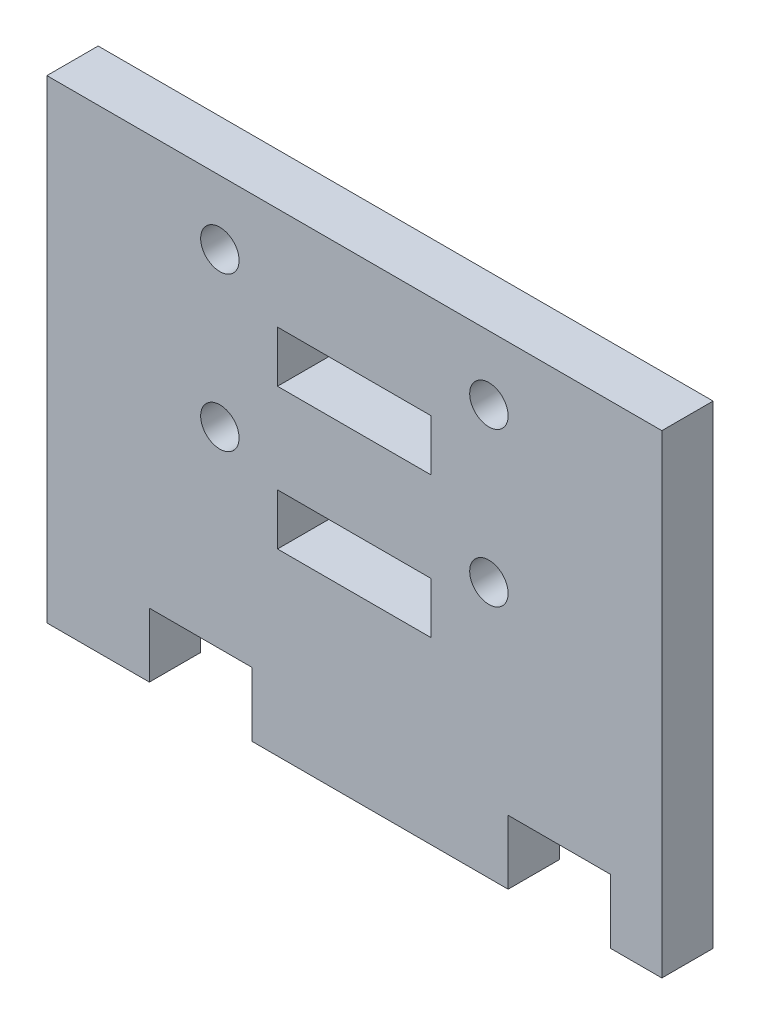
ISO-10303-21;
HEADER;
FILE_DESCRIPTION(('STEP AP214'),'2;1');
FILE_NAME('part.step','',(''),(''),'','','');
FILE_SCHEMA(('AUTOMOTIVE_DESIGN { 1 0 10303 214 1 1 1 1 }'));
ENDSEC;
DATA;
#1=APPLICATION_CONTEXT('core data for automotive mechanical design processes');
#2=APPLICATION_PROTOCOL_DEFINITION('international standard','automotive_design',2000,#1);
#3=PRODUCT_CONTEXT('',#1,'mechanical');
#4=PRODUCT('Part','Part','',(#3));
#5=PRODUCT_RELATED_PRODUCT_CATEGORY('part','',(#4));
#6=PRODUCT_DEFINITION_FORMATION('','',#4);
#7=PRODUCT_DEFINITION_CONTEXT('part definition',#1,'design');
#8=PRODUCT_DEFINITION('design','',#6,#7);
#9=PRODUCT_DEFINITION_SHAPE('','',#8);
#10=(LENGTH_UNIT() NAMED_UNIT(*) SI_UNIT(.MILLI.,.METRE.));
#11=(NAMED_UNIT(*) PLANE_ANGLE_UNIT() SI_UNIT($,.RADIAN.));
#12=(NAMED_UNIT(*) SI_UNIT($,.STERADIAN.) SOLID_ANGLE_UNIT());
#13=UNCERTAINTY_MEASURE_WITH_UNIT(LENGTH_MEASURE(1.E-05),#10,'distance_accuracy_value','');
#14=(GEOMETRIC_REPRESENTATION_CONTEXT(3) GLOBAL_UNCERTAINTY_ASSIGNED_CONTEXT((#13)) GLOBAL_UNIT_ASSIGNED_CONTEXT((#10,
#11,#12)) REPRESENTATION_CONTEXT('',''));
#15=CARTESIAN_POINT('',(0.,0.,0.));
#16=DIRECTION('',(0.,0.,1.));
#17=DIRECTION('',(1.,0.,0.));
#18=AXIS2_PLACEMENT_3D('',#15,#16,#17);
#19=CARTESIAN_POINT('',(0.,0.,2.));
#20=DIRECTION('',(0.,0.,-1.));
#21=DIRECTION('',(-1.,0.,0.));
#22=AXIS2_PLACEMENT_3D('',#19,#20,#21);
#23=PLANE('',#22);
#24=CARTESIAN_POINT('',(17.25,10.,2.));
#25=DIRECTION('',(0.,0.,1.));
#26=DIRECTION('',(-1.,0.,0.));
#27=AXIS2_PLACEMENT_3D('',#24,#25,#26);
#28=CIRCLE('',#27,0.750000000000002);
#29=CARTESIAN_POINT('',(16.5,10.,2.));
#30=VERTEX_POINT('',#29);
#31=EDGE_CURVE('E626',#30,#30,#28,.T.);
#32=ORIENTED_EDGE('',*,*,#31,.F.);
#33=EDGE_LOOP('',(#32));
#34=FACE_BOUND('',#33,.T.);
#35=DIRECTION('',(0.,-1.,0.));
#36=VECTOR('',#35,1.);
#37=CARTESIAN_POINT('',(9.00000000000001,9.,2.));
#38=LINE('',#37,#36);
#39=CARTESIAN_POINT('',(9.00000000000001,9.,2.));
#40=VERTEX_POINT('',#39);
#41=CARTESIAN_POINT('',(9.00000000000001,7.,2.));
#42=VERTEX_POINT('',#41);
#43=EDGE_CURVE('E169',#40,#42,#38,.T.);
#44=ORIENTED_EDGE('',*,*,#43,.F.);
#45=DIRECTION('',(-1.,0.,0.));
#46=VECTOR('',#45,1.);
#47=CARTESIAN_POINT('',(15.,9.,2.));
#48=LINE('',#47,#46);
#49=CARTESIAN_POINT('',(15.,9.,2.));
#50=VERTEX_POINT('',#49);
#51=EDGE_CURVE('E192',#50,#40,#48,.T.);
#52=ORIENTED_EDGE('',*,*,#51,.F.);
#53=DIRECTION('',(0.,1.,0.));
#54=VECTOR('',#53,1.);
#55=CARTESIAN_POINT('',(15.,7.,2.));
#56=LINE('',#55,#54);
#57=CARTESIAN_POINT('',(15.,7.,2.));
#58=VERTEX_POINT('',#57);
#59=EDGE_CURVE('E190',#58,#50,#56,.T.);
#60=ORIENTED_EDGE('',*,*,#59,.F.);
#61=DIRECTION('',(1.,0.,0.));
#62=VECTOR('',#61,1.);
#63=CARTESIAN_POINT('',(9.00000000000001,7.,2.));
#64=LINE('',#63,#62);
#65=EDGE_CURVE('E177',#42,#58,#64,.T.);
#66=ORIENTED_EDGE('',*,*,#65,.F.);
#67=EDGE_LOOP('',(#44,#52,#60,#66));
#68=FACE_BOUND('',#67,.T.);
#69=DIRECTION('',(1.,0.,0.));
#70=VECTOR('',#69,1.);
#71=CARTESIAN_POINT('',(9.00000000000001,12.5,2.));
#72=LINE('',#71,#70);
#73=CARTESIAN_POINT('',(9.00000000000001,12.5,2.));
#74=VERTEX_POINT('',#73);
#75=CARTESIAN_POINT('',(15.,12.5,2.));
#76=VERTEX_POINT('',#75);
#77=EDGE_CURVE('E214',#74,#76,#72,.T.);
#78=ORIENTED_EDGE('',*,*,#77,.F.);
#79=DIRECTION('',(0.,-1.,0.));
#80=VECTOR('',#79,1.);
#81=CARTESIAN_POINT('',(9.00000000000001,14.5,2.));
#82=LINE('',#81,#80);
#83=CARTESIAN_POINT('',(9.00000000000001,14.5,2.));
#84=VERTEX_POINT('',#83);
#85=EDGE_CURVE('E222',#84,#74,#82,.T.);
#86=ORIENTED_EDGE('',*,*,#85,.F.);
#87=DIRECTION('',(-1.,0.,0.));
#88=VECTOR('',#87,1.);
#89=CARTESIAN_POINT('',(15.,14.5,2.));
#90=LINE('',#89,#88);
#91=CARTESIAN_POINT('',(15.,14.5,2.));
#92=VERTEX_POINT('',#91);
#93=EDGE_CURVE('E219',#92,#84,#90,.T.);
#94=ORIENTED_EDGE('',*,*,#93,.F.);
#95=DIRECTION('',(0.,1.,0.));
#96=VECTOR('',#95,1.);
#97=CARTESIAN_POINT('',(15.,12.5,2.));
#98=LINE('',#97,#96);
#99=EDGE_CURVE('E216',#76,#92,#98,.T.);
#100=ORIENTED_EDGE('',*,*,#99,.F.);
#101=EDGE_LOOP('',(#78,#86,#94,#100));
#102=FACE_BOUND('',#101,.T.);
#103=DIRECTION('',(0.,-1.,0.));
#104=VECTOR('',#103,1.);
#105=CARTESIAN_POINT('',(0.,0.,2.));
#106=LINE('',#105,#104);
#107=CARTESIAN_POINT('',(0.,18.5,2.));
#108=VERTEX_POINT('',#107);
#109=CARTESIAN_POINT('',(0.,0.,2.));
#110=VERTEX_POINT('',#109);
#111=EDGE_CURVE('E245',#108,#110,#106,.T.);
#112=ORIENTED_EDGE('',*,*,#111,.T.);
#113=DIRECTION('',(1.,0.,0.));
#114=VECTOR('',#113,1.);
#115=CARTESIAN_POINT('',(4.,0.,2.));
#116=LINE('',#115,#114);
#117=CARTESIAN_POINT('',(4.,0.,2.));
#118=VERTEX_POINT('',#117);
#119=EDGE_CURVE('E248',#110,#118,#116,.T.);
#120=ORIENTED_EDGE('',*,*,#119,.T.);
#121=DIRECTION('',(0.,1.,0.));
#122=VECTOR('',#121,1.);
#123=CARTESIAN_POINT('',(4.,2.5,2.));
#124=LINE('',#123,#122);
#125=CARTESIAN_POINT('',(4.,2.5,2.));
#126=VERTEX_POINT('',#125);
#127=EDGE_CURVE('E251',#118,#126,#124,.T.);
#128=ORIENTED_EDGE('',*,*,#127,.T.);
#129=DIRECTION('',(1.,0.,0.));
#130=VECTOR('',#129,1.);
#131=CARTESIAN_POINT('',(4.,2.5,2.));
#132=LINE('',#131,#130);
#133=CARTESIAN_POINT('',(8.,2.5,2.));
#134=VERTEX_POINT('',#133);
#135=EDGE_CURVE('E253',#126,#134,#132,.T.);
#136=ORIENTED_EDGE('',*,*,#135,.T.);
#137=DIRECTION('',(0.,-1.,0.));
#138=VECTOR('',#137,1.);
#139=CARTESIAN_POINT('',(8.,0.,2.));
#140=LINE('',#139,#138);
#141=CARTESIAN_POINT('',(8.,0.,2.));
#142=VERTEX_POINT('',#141);
#143=EDGE_CURVE('E255',#134,#142,#140,.T.);
#144=ORIENTED_EDGE('',*,*,#143,.T.);
#145=DIRECTION('',(1.,0.,0.));
#146=VECTOR('',#145,1.);
#147=CARTESIAN_POINT('',(8.,0.,2.));
#148=LINE('',#147,#146);
#149=CARTESIAN_POINT('',(18.,0.,2.));
#150=VERTEX_POINT('',#149);
#151=EDGE_CURVE('E257',#142,#150,#148,.T.);
#152=ORIENTED_EDGE('',*,*,#151,.T.);
#153=DIRECTION('',(0.,1.,0.));
#154=VECTOR('',#153,1.);
#155=CARTESIAN_POINT('',(18.,0.,2.));
#156=LINE('',#155,#154);
#157=CARTESIAN_POINT('',(18.,2.5,2.));
#158=VERTEX_POINT('',#157);
#159=EDGE_CURVE('E259',#150,#158,#156,.T.);
#160=ORIENTED_EDGE('',*,*,#159,.T.);
#161=DIRECTION('',(1.,0.,0.));
#162=VECTOR('',#161,1.);
#163=CARTESIAN_POINT('',(18.,2.5,2.));
#164=LINE('',#163,#162);
#165=CARTESIAN_POINT('',(22.,2.5,2.));
#166=VERTEX_POINT('',#165);
#167=EDGE_CURVE('E261',#158,#166,#164,.T.);
#168=ORIENTED_EDGE('',*,*,#167,.T.);
#169=DIRECTION('',(0.,-1.,0.));
#170=VECTOR('',#169,1.);
#171=CARTESIAN_POINT('',(22.,2.5,2.));
#172=LINE('',#171,#170);
#173=CARTESIAN_POINT('',(22.,0.,2.));
#174=VERTEX_POINT('',#173);
#175=EDGE_CURVE('E263',#166,#174,#172,.T.);
#176=ORIENTED_EDGE('',*,*,#175,.T.);
#177=DIRECTION('',(1.,0.,0.));
#178=VECTOR('',#177,1.);
#179=CARTESIAN_POINT('',(22.,0.,2.));
#180=LINE('',#179,#178);
#181=CARTESIAN_POINT('',(24.,0.,2.));
#182=VERTEX_POINT('',#181);
#183=EDGE_CURVE('E265',#174,#182,#180,.T.);
#184=ORIENTED_EDGE('',*,*,#183,.T.);
#185=DIRECTION('',(0.,1.,0.));
#186=VECTOR('',#185,1.);
#187=CARTESIAN_POINT('',(24.,0.,2.));
#188=LINE('',#187,#186);
#189=CARTESIAN_POINT('',(24.,18.5,2.));
#190=VERTEX_POINT('',#189);
#191=EDGE_CURVE('E267',#182,#190,#188,.T.);
#192=ORIENTED_EDGE('',*,*,#191,.T.);
#193=DIRECTION('',(-1.,0.,0.));
#194=VECTOR('',#193,1.);
#195=CARTESIAN_POINT('',(0.,18.5,2.));
#196=LINE('',#195,#194);
#197=EDGE_CURVE('E269',#190,#108,#196,.T.);
#198=ORIENTED_EDGE('',*,*,#197,.T.);
#199=EDGE_LOOP('',(#112,#120,#128,#136,#144,#152,#160,#168,#176,#184,#192,#198));
#200=FACE_BOUND('',#199,.T.);
#201=CARTESIAN_POINT('',(6.75,16.,2.));
#202=DIRECTION('',(0.,0.,1.));
#203=DIRECTION('',(1.,0.,0.));
#204=AXIS2_PLACEMENT_3D('',#201,#202,#203);
#205=CIRCLE('',#204,0.750000000000002);
#206=CARTESIAN_POINT('',(7.50000000000001,16.,2.));
#207=VERTEX_POINT('',#206);
#208=EDGE_CURVE('E208',#207,#207,#205,.T.);
#209=ORIENTED_EDGE('',*,*,#208,.F.);
#210=EDGE_LOOP('',(#209));
#211=FACE_BOUND('',#210,.T.);
#212=CARTESIAN_POINT('',(6.75,9.99999999999999,2.));
#213=DIRECTION('',(0.,0.,1.));
#214=DIRECTION('',(1.,0.,0.));
#215=AXIS2_PLACEMENT_3D('',#212,#213,#214);
#216=CIRCLE('',#215,0.750000000000002);
#217=CARTESIAN_POINT('',(7.50000000000001,9.99999999999999,2.));
#218=VERTEX_POINT('',#217);
#219=EDGE_CURVE('E198',#218,#218,#216,.T.);
#220=ORIENTED_EDGE('',*,*,#219,.F.);
#221=EDGE_LOOP('',(#220));
#222=FACE_BOUND('',#221,.T.);
#223=CARTESIAN_POINT('',(17.25,16.,2.));
#224=DIRECTION('',(0.,0.,1.));
#225=DIRECTION('',(-1.,0.,0.));
#226=AXIS2_PLACEMENT_3D('',#223,#224,#225);
#227=CIRCLE('',#226,0.750000000000002);
#228=CARTESIAN_POINT('',(16.5,16.,2.));
#229=VERTEX_POINT('',#228);
#230=EDGE_CURVE('E617',#229,#229,#227,.T.);
#231=ORIENTED_EDGE('',*,*,#230,.F.);
#232=EDGE_LOOP('',(#231));
#233=FACE_BOUND('',#232,.T.);
#234=ADVANCED_FACE('F32',(#34,#68,#102,#200,#211,#222,#233),#23,.F.);
#235=CARTESIAN_POINT('',(0.,0.,0.));
#236=DIRECTION('',(0.,0.,-1.));
#237=DIRECTION('',(-1.,0.,0.));
#238=AXIS2_PLACEMENT_3D('',#235,#236,#237);
#239=PLANE('',#238);
#240=CARTESIAN_POINT('',(17.25,10.,0.));
#241=DIRECTION('',(0.,0.,1.));
#242=DIRECTION('',(-1.,0.,0.));
#243=AXIS2_PLACEMENT_3D('',#240,#241,#242);
#244=CIRCLE('',#243,0.750000000000002);
#245=CARTESIAN_POINT('',(16.5,10.,0.));
#246=VERTEX_POINT('',#245);
#247=EDGE_CURVE('E623',#246,#246,#244,.T.);
#248=ORIENTED_EDGE('',*,*,#247,.T.);
#249=EDGE_LOOP('',(#248));
#250=FACE_BOUND('',#249,.T.);
#251=DIRECTION('',(-1.,0.,0.));
#252=VECTOR('',#251,1.);
#253=CARTESIAN_POINT('',(15.,9.,0.));
#254=LINE('',#253,#252);
#255=CARTESIAN_POINT('',(15.,9.,0.));
#256=VERTEX_POINT('',#255);
#257=CARTESIAN_POINT('',(9.00000000000001,9.,0.));
#258=VERTEX_POINT('',#257);
#259=EDGE_CURVE('E178',#256,#258,#254,.T.);
#260=ORIENTED_EDGE('',*,*,#259,.T.);
#261=DIRECTION('',(0.,-1.,0.));
#262=VECTOR('',#261,1.);
#263=CARTESIAN_POINT('',(9.00000000000001,9.,0.));
#264=LINE('',#263,#262);
#265=CARTESIAN_POINT('',(9.00000000000001,7.,0.));
#266=VERTEX_POINT('',#265);
#267=EDGE_CURVE('E55',#258,#266,#264,.T.);
#268=ORIENTED_EDGE('',*,*,#267,.T.);
#269=DIRECTION('',(1.,0.,0.));
#270=VECTOR('',#269,1.);
#271=CARTESIAN_POINT('',(9.00000000000001,7.,0.));
#272=LINE('',#271,#270);
#273=CARTESIAN_POINT('',(15.,7.,0.));
#274=VERTEX_POINT('',#273);
#275=EDGE_CURVE('E184',#266,#274,#272,.T.);
#276=ORIENTED_EDGE('',*,*,#275,.T.);
#277=DIRECTION('',(0.,1.,0.));
#278=VECTOR('',#277,1.);
#279=CARTESIAN_POINT('',(15.,7.,0.));
#280=LINE('',#279,#278);
#281=EDGE_CURVE('E200',#274,#256,#280,.T.);
#282=ORIENTED_EDGE('',*,*,#281,.T.);
#283=EDGE_LOOP('',(#260,#268,#276,#282));
#284=FACE_BOUND('',#283,.T.);
#285=DIRECTION('',(0.,-1.,0.));
#286=VECTOR('',#285,1.);
#287=CARTESIAN_POINT('',(9.00000000000001,14.5,0.));
#288=LINE('',#287,#286);
#289=CARTESIAN_POINT('',(9.00000000000001,14.5,0.));
#290=VERTEX_POINT('',#289);
#291=CARTESIAN_POINT('',(9.00000000000001,12.5,0.));
#292=VERTEX_POINT('',#291);
#293=EDGE_CURVE('E217',#290,#292,#288,.T.);
#294=ORIENTED_EDGE('',*,*,#293,.T.);
#295=DIRECTION('',(1.,0.,0.));
#296=VECTOR('',#295,1.);
#297=CARTESIAN_POINT('',(9.00000000000001,12.5,0.));
#298=LINE('',#297,#296);
#299=CARTESIAN_POINT('',(15.,12.5,0.));
#300=VERTEX_POINT('',#299);
#301=EDGE_CURVE('E211',#292,#300,#298,.T.);
#302=ORIENTED_EDGE('',*,*,#301,.T.);
#303=DIRECTION('',(0.,1.,0.));
#304=VECTOR('',#303,1.);
#305=CARTESIAN_POINT('',(15.,12.5,0.));
#306=LINE('',#305,#304);
#307=CARTESIAN_POINT('',(15.,14.5,0.));
#308=VERTEX_POINT('',#307);
#309=EDGE_CURVE('E227',#300,#308,#306,.T.);
#310=ORIENTED_EDGE('',*,*,#309,.T.);
#311=DIRECTION('',(-1.,0.,0.));
#312=VECTOR('',#311,1.);
#313=CARTESIAN_POINT('',(15.,14.5,0.));
#314=LINE('',#313,#312);
#315=EDGE_CURVE('E230',#308,#290,#314,.T.);
#316=ORIENTED_EDGE('',*,*,#315,.T.);
#317=EDGE_LOOP('',(#294,#302,#310,#316));
#318=FACE_BOUND('',#317,.T.);
#319=DIRECTION('',(0.,-1.,0.));
#320=VECTOR('',#319,1.);
#321=CARTESIAN_POINT('',(0.,0.,0.));
#322=LINE('',#321,#320);
#323=CARTESIAN_POINT('',(0.,18.5,0.));
#324=VERTEX_POINT('',#323);
#325=CARTESIAN_POINT('',(0.,0.,0.));
#326=VERTEX_POINT('',#325);
#327=EDGE_CURVE('E244',#324,#326,#322,.T.);
#328=ORIENTED_EDGE('',*,*,#327,.F.);
#329=DIRECTION('',(-1.,0.,0.));
#330=VECTOR('',#329,1.);
#331=CARTESIAN_POINT('',(0.,18.5,0.));
#332=LINE('',#331,#330);
#333=CARTESIAN_POINT('',(24.,18.5,0.));
#334=VERTEX_POINT('',#333);
#335=EDGE_CURVE('E249',#334,#324,#332,.T.);
#336=ORIENTED_EDGE('',*,*,#335,.F.);
#337=DIRECTION('',(0.,1.,0.));
#338=VECTOR('',#337,1.);
#339=CARTESIAN_POINT('',(24.,0.,0.));
#340=LINE('',#339,#338);
#341=CARTESIAN_POINT('',(24.,0.,0.));
#342=VERTEX_POINT('',#341);
#343=EDGE_CURVE('E292',#342,#334,#340,.T.);
#344=ORIENTED_EDGE('',*,*,#343,.F.);
#345=DIRECTION('',(1.,0.,0.));
#346=VECTOR('',#345,1.);
#347=CARTESIAN_POINT('',(22.,0.,0.));
#348=LINE('',#347,#346);
#349=CARTESIAN_POINT('',(22.,0.,0.));
#350=VERTEX_POINT('',#349);
#351=EDGE_CURVE('E290',#350,#342,#348,.T.);
#352=ORIENTED_EDGE('',*,*,#351,.F.);
#353=DIRECTION('',(0.,-1.,0.));
#354=VECTOR('',#353,1.);
#355=CARTESIAN_POINT('',(22.,2.5,0.));
#356=LINE('',#355,#354);
#357=CARTESIAN_POINT('',(22.,2.5,0.));
#358=VERTEX_POINT('',#357);
#359=EDGE_CURVE('E288',#358,#350,#356,.T.);
#360=ORIENTED_EDGE('',*,*,#359,.F.);
#361=DIRECTION('',(1.,0.,0.));
#362=VECTOR('',#361,1.);
#363=CARTESIAN_POINT('',(18.,2.5,0.));
#364=LINE('',#363,#362);
#365=CARTESIAN_POINT('',(18.,2.5,0.));
#366=VERTEX_POINT('',#365);
#367=EDGE_CURVE('E286',#366,#358,#364,.T.);
#368=ORIENTED_EDGE('',*,*,#367,.F.);
#369=DIRECTION('',(0.,1.,0.));
#370=VECTOR('',#369,1.);
#371=CARTESIAN_POINT('',(18.,0.,0.));
#372=LINE('',#371,#370);
#373=CARTESIAN_POINT('',(18.,0.,0.));
#374=VERTEX_POINT('',#373);
#375=EDGE_CURVE('E284',#374,#366,#372,.T.);
#376=ORIENTED_EDGE('',*,*,#375,.F.);
#377=DIRECTION('',(1.,0.,0.));
#378=VECTOR('',#377,1.);
#379=CARTESIAN_POINT('',(8.,0.,0.));
#380=LINE('',#379,#378);
#381=CARTESIAN_POINT('',(8.,0.,0.));
#382=VERTEX_POINT('',#381);
#383=EDGE_CURVE('E282',#382,#374,#380,.T.);
#384=ORIENTED_EDGE('',*,*,#383,.F.);
#385=DIRECTION('',(0.,-1.,0.));
#386=VECTOR('',#385,1.);
#387=CARTESIAN_POINT('',(8.,0.,0.));
#388=LINE('',#387,#386);
#389=CARTESIAN_POINT('',(8.,2.5,0.));
#390=VERTEX_POINT('',#389);
#391=EDGE_CURVE('E280',#390,#382,#388,.T.);
#392=ORIENTED_EDGE('',*,*,#391,.F.);
#393=DIRECTION('',(1.,0.,0.));
#394=VECTOR('',#393,1.);
#395=CARTESIAN_POINT('',(4.,2.5,0.));
#396=LINE('',#395,#394);
#397=CARTESIAN_POINT('',(4.,2.5,0.));
#398=VERTEX_POINT('',#397);
#399=EDGE_CURVE('E278',#398,#390,#396,.T.);
#400=ORIENTED_EDGE('',*,*,#399,.F.);
#401=DIRECTION('',(0.,1.,0.));
#402=VECTOR('',#401,1.);
#403=CARTESIAN_POINT('',(4.,2.5,0.));
#404=LINE('',#403,#402);
#405=CARTESIAN_POINT('',(4.,0.,0.));
#406=VERTEX_POINT('',#405);
#407=EDGE_CURVE('E276',#406,#398,#404,.T.);
#408=ORIENTED_EDGE('',*,*,#407,.F.);
#409=DIRECTION('',(1.,0.,0.));
#410=VECTOR('',#409,1.);
#411=CARTESIAN_POINT('',(4.,0.,0.));
#412=LINE('',#411,#410);
#413=EDGE_CURVE('E274',#326,#406,#412,.T.);
#414=ORIENTED_EDGE('',*,*,#413,.F.);
#415=EDGE_LOOP('',(#328,#336,#344,#352,#360,#368,#376,#384,#392,#400,#408,#414));
#416=FACE_BOUND('',#415,.T.);
#417=CARTESIAN_POINT('',(6.75,16.,0.));
#418=DIRECTION('',(0.,0.,1.));
#419=DIRECTION('',(1.,0.,0.));
#420=AXIS2_PLACEMENT_3D('',#417,#418,#419);
#421=CIRCLE('',#420,0.750000000000002);
#422=CARTESIAN_POINT('',(7.50000000000001,16.,0.));
#423=VERTEX_POINT('',#422);
#424=EDGE_CURVE('E185',#423,#423,#421,.T.);
#425=ORIENTED_EDGE('',*,*,#424,.T.);
#426=EDGE_LOOP('',(#425));
#427=FACE_BOUND('',#426,.T.);
#428=CARTESIAN_POINT('',(6.75,9.99999999999999,0.));
#429=DIRECTION('',(0.,0.,1.));
#430=DIRECTION('',(1.,0.,0.));
#431=AXIS2_PLACEMENT_3D('',#428,#429,#430);
#432=CIRCLE('',#431,0.750000000000002);
#433=CARTESIAN_POINT('',(7.50000000000001,9.99999999999999,0.));
#434=VERTEX_POINT('',#433);
#435=EDGE_CURVE('E629',#434,#434,#432,.T.);
#436=ORIENTED_EDGE('',*,*,#435,.T.);
#437=EDGE_LOOP('',(#436));
#438=FACE_BOUND('',#437,.T.);
#439=CARTESIAN_POINT('',(17.25,16.,0.));
#440=DIRECTION('',(0.,0.,1.));
#441=DIRECTION('',(-1.,0.,0.));
#442=AXIS2_PLACEMENT_3D('',#439,#440,#441);
#443=CIRCLE('',#442,0.750000000000002);
#444=CARTESIAN_POINT('',(16.5,16.,0.));
#445=VERTEX_POINT('',#444);
#446=EDGE_CURVE('E620',#445,#445,#443,.T.);
#447=ORIENTED_EDGE('',*,*,#446,.T.);
#448=EDGE_LOOP('',(#447));
#449=FACE_BOUND('',#448,.T.);
#450=ADVANCED_FACE('F334',(#250,#284,#318,#416,#427,#438,#449),#239,.T.);
#451=CARTESIAN_POINT('',(0.,0.,2.));
#452=DIRECTION('',(1.,0.,0.));
#453=DIRECTION('',(0.,0.,-1.));
#454=AXIS2_PLACEMENT_3D('',#451,#452,#453);
#455=PLANE('',#454);
#456=ORIENTED_EDGE('',*,*,#327,.T.);
#457=DIRECTION('',(0.,0.,-1.));
#458=VECTOR('',#457,1.);
#459=CARTESIAN_POINT('',(0.,0.,2.));
#460=LINE('',#459,#458);
#461=EDGE_CURVE('E11',#110,#326,#460,.T.);
#462=ORIENTED_EDGE('',*,*,#461,.F.);
#463=ORIENTED_EDGE('',*,*,#111,.F.);
#464=DIRECTION('',(0.,0.,-1.));
#465=VECTOR('',#464,1.);
#466=CARTESIAN_POINT('',(0.,18.5,2.));
#467=LINE('',#466,#465);
#468=EDGE_CURVE('E271',#108,#324,#467,.T.);
#469=ORIENTED_EDGE('',*,*,#468,.T.);
#470=EDGE_LOOP('',(#456,#462,#463,#469));
#471=FACE_BOUND('',#470,.T.);
#472=ADVANCED_FACE('F34',(#471),#455,.F.);
#473=CARTESIAN_POINT('',(4.,0.,2.));
#474=DIRECTION('',(0.,1.,0.));
#475=DIRECTION('',(-1.,0.,0.));
#476=AXIS2_PLACEMENT_3D('',#473,#474,#475);
#477=PLANE('',#476);
#478=ORIENTED_EDGE('',*,*,#413,.T.);
#479=DIRECTION('',(0.,0.,-1.));
#480=VECTOR('',#479,1.);
#481=CARTESIAN_POINT('',(4.,0.,2.));
#482=LINE('',#481,#480);
#483=EDGE_CURVE('E40',#118,#406,#482,.T.);
#484=ORIENTED_EDGE('',*,*,#483,.F.);
#485=ORIENTED_EDGE('',*,*,#119,.F.);
#486=ORIENTED_EDGE('',*,*,#461,.T.);
#487=EDGE_LOOP('',(#478,#484,#485,#486));
#488=FACE_BOUND('',#487,.T.);
#489=ADVANCED_FACE('F352',(#488),#477,.F.);
#490=CARTESIAN_POINT('',(4.,2.5,2.));
#491=DIRECTION('',(-1.,0.,0.));
#492=DIRECTION('',(0.,-1.,0.));
#493=AXIS2_PLACEMENT_3D('',#490,#491,#492);
#494=PLANE('',#493);
#495=ORIENTED_EDGE('',*,*,#407,.T.);
#496=DIRECTION('',(0.,0.,-1.));
#497=VECTOR('',#496,1.);
#498=CARTESIAN_POINT('',(4.,2.5,2.));
#499=LINE('',#498,#497);
#500=EDGE_CURVE('E321',#126,#398,#499,.T.);
#501=ORIENTED_EDGE('',*,*,#500,.F.);
#502=ORIENTED_EDGE('',*,*,#127,.F.);
#503=ORIENTED_EDGE('',*,*,#483,.T.);
#504=EDGE_LOOP('',(#495,#501,#502,#503));
#505=FACE_BOUND('',#504,.T.);
#506=ADVANCED_FACE('F328',(#505),#494,.F.);
#507=CARTESIAN_POINT('',(4.,2.5,2.));
#508=DIRECTION('',(0.,1.,0.));
#509=DIRECTION('',(-1.,0.,0.));
#510=AXIS2_PLACEMENT_3D('',#507,#508,#509);
#511=PLANE('',#510);
#512=ORIENTED_EDGE('',*,*,#399,.T.);
#513=DIRECTION('',(0.,0.,-1.));
#514=VECTOR('',#513,1.);
#515=CARTESIAN_POINT('',(8.,2.5,2.));
#516=LINE('',#515,#514);
#517=EDGE_CURVE('E318',#134,#390,#516,.T.);
#518=ORIENTED_EDGE('',*,*,#517,.F.);
#519=ORIENTED_EDGE('',*,*,#135,.F.);
#520=ORIENTED_EDGE('',*,*,#500,.T.);
#521=EDGE_LOOP('',(#512,#518,#519,#520));
#522=FACE_BOUND('',#521,.T.);
#523=ADVANCED_FACE('F340',(#522),#511,.F.);
#524=CARTESIAN_POINT('',(8.,0.,2.));
#525=DIRECTION('',(1.,0.,0.));
#526=DIRECTION('',(0.,0.,-1.));
#527=AXIS2_PLACEMENT_3D('',#524,#525,#526);
#528=PLANE('',#527);
#529=ORIENTED_EDGE('',*,*,#391,.T.);
#530=DIRECTION('',(0.,0.,-1.));
#531=VECTOR('',#530,1.);
#532=CARTESIAN_POINT('',(8.,0.,2.));
#533=LINE('',#532,#531);
#534=EDGE_CURVE('E315',#142,#382,#533,.T.);
#535=ORIENTED_EDGE('',*,*,#534,.F.);
#536=ORIENTED_EDGE('',*,*,#143,.F.);
#537=ORIENTED_EDGE('',*,*,#517,.T.);
#538=EDGE_LOOP('',(#529,#535,#536,#537));
#539=FACE_BOUND('',#538,.T.);
#540=ADVANCED_FACE('F344',(#539),#528,.F.);
#541=CARTESIAN_POINT('',(8.,0.,2.));
#542=DIRECTION('',(0.,1.,0.));
#543=DIRECTION('',(-1.,0.,0.));
#544=AXIS2_PLACEMENT_3D('',#541,#542,#543);
#545=PLANE('',#544);
#546=ORIENTED_EDGE('',*,*,#383,.T.);
#547=DIRECTION('',(0.,0.,-1.));
#548=VECTOR('',#547,1.);
#549=CARTESIAN_POINT('',(18.,0.,2.));
#550=LINE('',#549,#548);
#551=EDGE_CURVE('E312',#150,#374,#550,.T.);
#552=ORIENTED_EDGE('',*,*,#551,.F.);
#553=ORIENTED_EDGE('',*,*,#151,.F.);
#554=ORIENTED_EDGE('',*,*,#534,.T.);
#555=EDGE_LOOP('',(#546,#552,#553,#554));
#556=FACE_BOUND('',#555,.T.);
#557=ADVANCED_FACE('F385',(#556),#545,.F.);
#558=CARTESIAN_POINT('',(18.,0.,2.));
#559=DIRECTION('',(-1.,0.,0.));
#560=DIRECTION('',(0.,0.,1.));
#561=AXIS2_PLACEMENT_3D('',#558,#559,#560);
#562=PLANE('',#561);
#563=ORIENTED_EDGE('',*,*,#375,.T.);
#564=DIRECTION('',(0.,0.,-1.));
#565=VECTOR('',#564,1.);
#566=CARTESIAN_POINT('',(18.,2.5,2.));
#567=LINE('',#566,#565);
#568=EDGE_CURVE('E309',#158,#366,#567,.T.);
#569=ORIENTED_EDGE('',*,*,#568,.F.);
#570=ORIENTED_EDGE('',*,*,#159,.F.);
#571=ORIENTED_EDGE('',*,*,#551,.T.);
#572=EDGE_LOOP('',(#563,#569,#570,#571));
#573=FACE_BOUND('',#572,.T.);
#574=ADVANCED_FACE('F383',(#573),#562,.F.);
#575=CARTESIAN_POINT('',(18.,2.5,2.));
#576=DIRECTION('',(0.,1.,0.));
#577=DIRECTION('',(-1.,0.,0.));
#578=AXIS2_PLACEMENT_3D('',#575,#576,#577);
#579=PLANE('',#578);
#580=ORIENTED_EDGE('',*,*,#367,.T.);
#581=DIRECTION('',(0.,0.,-1.));
#582=VECTOR('',#581,1.);
#583=CARTESIAN_POINT('',(22.,2.5,2.));
#584=LINE('',#583,#582);
#585=EDGE_CURVE('E306',#166,#358,#584,.T.);
#586=ORIENTED_EDGE('',*,*,#585,.F.);
#587=ORIENTED_EDGE('',*,*,#167,.F.);
#588=ORIENTED_EDGE('',*,*,#568,.T.);
#589=EDGE_LOOP('',(#580,#586,#587,#588));
#590=FACE_BOUND('',#589,.T.);
#591=ADVANCED_FACE('F379',(#590),#579,.F.);
#592=CARTESIAN_POINT('',(22.,2.5,2.));
#593=DIRECTION('',(1.,0.,0.));
#594=DIRECTION('',(0.,1.,0.));
#595=AXIS2_PLACEMENT_3D('',#592,#593,#594);
#596=PLANE('',#595);
#597=ORIENTED_EDGE('',*,*,#359,.T.);
#598=DIRECTION('',(0.,0.,-1.));
#599=VECTOR('',#598,1.);
#600=CARTESIAN_POINT('',(22.,0.,2.));
#601=LINE('',#600,#599);
#602=EDGE_CURVE('E303',#174,#350,#601,.T.);
#603=ORIENTED_EDGE('',*,*,#602,.F.);
#604=ORIENTED_EDGE('',*,*,#175,.F.);
#605=ORIENTED_EDGE('',*,*,#585,.T.);
#606=EDGE_LOOP('',(#597,#603,#604,#605));
#607=FACE_BOUND('',#606,.T.);
#608=ADVANCED_FACE('F374',(#607),#596,.F.);
#609=CARTESIAN_POINT('',(22.,0.,2.));
#610=DIRECTION('',(0.,1.,0.));
#611=DIRECTION('',(0.,0.,1.));
#612=AXIS2_PLACEMENT_3D('',#609,#610,#611);
#613=PLANE('',#612);
#614=ORIENTED_EDGE('',*,*,#351,.T.);
#615=DIRECTION('',(0.,0.,-1.));
#616=VECTOR('',#615,1.);
#617=CARTESIAN_POINT('',(24.,0.,2.));
#618=LINE('',#617,#616);
#619=EDGE_CURVE('E300',#182,#342,#618,.T.);
#620=ORIENTED_EDGE('',*,*,#619,.F.);
#621=ORIENTED_EDGE('',*,*,#183,.F.);
#622=ORIENTED_EDGE('',*,*,#602,.T.);
#623=EDGE_LOOP('',(#614,#620,#621,#622));
#624=FACE_BOUND('',#623,.T.);
#625=ADVANCED_FACE('F368',(#624),#613,.F.);
#626=CARTESIAN_POINT('',(24.,0.,2.));
#627=DIRECTION('',(-1.,0.,0.));
#628=DIRECTION('',(0.,0.,1.));
#629=AXIS2_PLACEMENT_3D('',#626,#627,#628);
#630=PLANE('',#629);
#631=ORIENTED_EDGE('',*,*,#343,.T.);
#632=DIRECTION('',(0.,0.,-1.));
#633=VECTOR('',#632,1.);
#634=CARTESIAN_POINT('',(24.,18.5,2.));
#635=LINE('',#634,#633);
#636=EDGE_CURVE('E297',#190,#334,#635,.T.);
#637=ORIENTED_EDGE('',*,*,#636,.F.);
#638=ORIENTED_EDGE('',*,*,#191,.F.);
#639=ORIENTED_EDGE('',*,*,#619,.T.);
#640=EDGE_LOOP('',(#631,#637,#638,#639));
#641=FACE_BOUND('',#640,.T.);
#642=ADVANCED_FACE('F364',(#641),#630,.F.);
#643=CARTESIAN_POINT('',(0.,18.5,2.));
#644=DIRECTION('',(0.,-1.,0.));
#645=DIRECTION('',(0.,0.,-1.));
#646=AXIS2_PLACEMENT_3D('',#643,#644,#645);
#647=PLANE('',#646);
#648=ORIENTED_EDGE('',*,*,#335,.T.);
#649=ORIENTED_EDGE('',*,*,#468,.F.);
#650=ORIENTED_EDGE('',*,*,#197,.F.);
#651=ORIENTED_EDGE('',*,*,#636,.T.);
#652=EDGE_LOOP('',(#648,#649,#650,#651));
#653=FACE_BOUND('',#652,.T.);
#654=ADVANCED_FACE('F359',(#653),#647,.F.);
#655=CARTESIAN_POINT('',(9.00000000000001,12.5,2.));
#656=DIRECTION('',(0.,1.,0.));
#657=DIRECTION('',(0.,0.,1.));
#658=AXIS2_PLACEMENT_3D('',#655,#656,#657);
#659=PLANE('',#658);
#660=ORIENTED_EDGE('',*,*,#301,.F.);
#661=DIRECTION('',(0.,0.,-1.));
#662=VECTOR('',#661,1.);
#663=CARTESIAN_POINT('',(9.00000000000001,12.5,2.));
#664=LINE('',#663,#662);
#665=EDGE_CURVE('E224',#74,#292,#664,.T.);
#666=ORIENTED_EDGE('',*,*,#665,.F.);
#667=ORIENTED_EDGE('',*,*,#77,.T.);
#668=DIRECTION('',(0.,0.,-1.));
#669=VECTOR('',#668,1.);
#670=CARTESIAN_POINT('',(15.,12.5,2.));
#671=LINE('',#670,#669);
#672=EDGE_CURVE('E241',#76,#300,#671,.T.);
#673=ORIENTED_EDGE('',*,*,#672,.T.);
#674=EDGE_LOOP('',(#660,#666,#667,#673));
#675=FACE_BOUND('',#674,.T.);
#676=ADVANCED_FACE('F404',(#675),#659,.T.);
#677=CARTESIAN_POINT('',(15.,12.5,2.));
#678=DIRECTION('',(-1.,0.,0.));
#679=DIRECTION('',(0.,0.,1.));
#680=AXIS2_PLACEMENT_3D('',#677,#678,#679);
#681=PLANE('',#680);
#682=ORIENTED_EDGE('',*,*,#309,.F.);
#683=ORIENTED_EDGE('',*,*,#672,.F.);
#684=ORIENTED_EDGE('',*,*,#99,.T.);
#685=DIRECTION('',(0.,0.,-1.));
#686=VECTOR('',#685,1.);
#687=CARTESIAN_POINT('',(15.,14.5,2.));
#688=LINE('',#687,#686);
#689=EDGE_CURVE('E239',#92,#308,#688,.T.);
#690=ORIENTED_EDGE('',*,*,#689,.T.);
#691=EDGE_LOOP('',(#682,#683,#684,#690));
#692=FACE_BOUND('',#691,.T.);
#693=ADVANCED_FACE('F442',(#692),#681,.T.);
#694=CARTESIAN_POINT('',(15.,14.5,2.));
#695=DIRECTION('',(0.,-1.,0.));
#696=DIRECTION('',(0.,0.,-1.));
#697=AXIS2_PLACEMENT_3D('',#694,#695,#696);
#698=PLANE('',#697);
#699=ORIENTED_EDGE('',*,*,#315,.F.);
#700=ORIENTED_EDGE('',*,*,#689,.F.);
#701=ORIENTED_EDGE('',*,*,#93,.T.);
#702=DIRECTION('',(0.,0.,-1.));
#703=VECTOR('',#702,1.);
#704=CARTESIAN_POINT('',(9.00000000000001,14.5,2.));
#705=LINE('',#704,#703);
#706=EDGE_CURVE('E237',#84,#290,#705,.T.);
#707=ORIENTED_EDGE('',*,*,#706,.T.);
#708=EDGE_LOOP('',(#699,#700,#701,#707));
#709=FACE_BOUND('',#708,.T.);
#710=ADVANCED_FACE('F449',(#709),#698,.T.);
#711=CARTESIAN_POINT('',(9.00000000000001,14.5,2.));
#712=DIRECTION('',(1.,0.,0.));
#713=DIRECTION('',(0.,0.,-1.));
#714=AXIS2_PLACEMENT_3D('',#711,#712,#713);
#715=PLANE('',#714);
#716=ORIENTED_EDGE('',*,*,#293,.F.);
#717=ORIENTED_EDGE('',*,*,#706,.F.);
#718=ORIENTED_EDGE('',*,*,#85,.T.);
#719=ORIENTED_EDGE('',*,*,#665,.T.);
#720=EDGE_LOOP('',(#716,#717,#718,#719));
#721=FACE_BOUND('',#720,.T.);
#722=ADVANCED_FACE('F456',(#721),#715,.T.);
#723=CARTESIAN_POINT('',(6.75,16.,2.));
#724=DIRECTION('',(0.,0.,-1.));
#725=DIRECTION('',(-1.,0.,0.));
#726=AXIS2_PLACEMENT_3D('',#723,#724,#725);
#727=CYLINDRICAL_SURFACE('',#726,0.750000000000002);
#728=ORIENTED_EDGE('',*,*,#208,.T.);
#729=EDGE_LOOP('',(#728));
#730=FACE_BOUND('',#729,.T.);
#731=ORIENTED_EDGE('',*,*,#424,.F.);
#732=EDGE_LOOP('',(#731));
#733=FACE_BOUND('',#732,.T.);
#734=ADVANCED_FACE('F464',(#730,#733),#727,.F.);
#735=CARTESIAN_POINT('',(9.00000000000001,9.,2.));
#736=DIRECTION('',(1.,0.,0.));
#737=DIRECTION('',(0.,0.,-1.));
#738=AXIS2_PLACEMENT_3D('',#735,#736,#737);
#739=PLANE('',#738);
#740=ORIENTED_EDGE('',*,*,#267,.F.);
#741=DIRECTION('',(0.,0.,-1.));
#742=VECTOR('',#741,1.);
#743=CARTESIAN_POINT('',(9.00000000000001,9.,2.));
#744=LINE('',#743,#742);
#745=EDGE_CURVE('E173',#40,#258,#744,.T.);
#746=ORIENTED_EDGE('',*,*,#745,.F.);
#747=ORIENTED_EDGE('',*,*,#43,.T.);
#748=DIRECTION('',(0.,0.,-1.));
#749=VECTOR('',#748,1.);
#750=CARTESIAN_POINT('',(9.00000000000001,7.,2.));
#751=LINE('',#750,#749);
#752=EDGE_CURVE('E172',#42,#266,#751,.T.);
#753=ORIENTED_EDGE('',*,*,#752,.T.);
#754=EDGE_LOOP('',(#740,#746,#747,#753));
#755=FACE_BOUND('',#754,.T.);
#756=ADVANCED_FACE('F171',(#755),#739,.T.);
#757=CARTESIAN_POINT('',(9.00000000000001,7.,2.));
#758=DIRECTION('',(0.,1.,0.));
#759=DIRECTION('',(0.,0.,1.));
#760=AXIS2_PLACEMENT_3D('',#757,#758,#759);
#761=PLANE('',#760);
#762=ORIENTED_EDGE('',*,*,#275,.F.);
#763=ORIENTED_EDGE('',*,*,#752,.F.);
#764=ORIENTED_EDGE('',*,*,#65,.T.);
#765=DIRECTION('',(0.,0.,-1.));
#766=VECTOR('',#765,1.);
#767=CARTESIAN_POINT('',(15.,7.,2.));
#768=LINE('',#767,#766);
#769=EDGE_CURVE('E186',#58,#274,#768,.T.);
#770=ORIENTED_EDGE('',*,*,#769,.T.);
#771=EDGE_LOOP('',(#762,#763,#764,#770));
#772=FACE_BOUND('',#771,.T.);
#773=ADVANCED_FACE('F181',(#772),#761,.T.);
#774=CARTESIAN_POINT('',(15.,7.,2.));
#775=DIRECTION('',(-1.,0.,0.));
#776=DIRECTION('',(0.,0.,1.));
#777=AXIS2_PLACEMENT_3D('',#774,#775,#776);
#778=PLANE('',#777);
#779=ORIENTED_EDGE('',*,*,#281,.F.);
#780=ORIENTED_EDGE('',*,*,#769,.F.);
#781=ORIENTED_EDGE('',*,*,#59,.T.);
#782=DIRECTION('',(0.,0.,-1.));
#783=VECTOR('',#782,1.);
#784=CARTESIAN_POINT('',(15.,9.,2.));
#785=LINE('',#784,#783);
#786=EDGE_CURVE('E47',#50,#256,#785,.T.);
#787=ORIENTED_EDGE('',*,*,#786,.T.);
#788=EDGE_LOOP('',(#779,#780,#781,#787));
#789=FACE_BOUND('',#788,.T.);
#790=ADVANCED_FACE('F485',(#789),#778,.T.);
#791=CARTESIAN_POINT('',(15.,9.,2.));
#792=DIRECTION('',(0.,-1.,0.));
#793=DIRECTION('',(0.,0.,-1.));
#794=AXIS2_PLACEMENT_3D('',#791,#792,#793);
#795=PLANE('',#794);
#796=ORIENTED_EDGE('',*,*,#259,.F.);
#797=ORIENTED_EDGE('',*,*,#786,.F.);
#798=ORIENTED_EDGE('',*,*,#51,.T.);
#799=ORIENTED_EDGE('',*,*,#745,.T.);
#800=EDGE_LOOP('',(#796,#797,#798,#799));
#801=FACE_BOUND('',#800,.T.);
#802=ADVANCED_FACE('F492',(#801),#795,.T.);
#803=CARTESIAN_POINT('',(6.75,9.99999999999999,2.));
#804=DIRECTION('',(0.,0.,-1.));
#805=DIRECTION('',(-1.,0.,0.));
#806=AXIS2_PLACEMENT_3D('',#803,#804,#805);
#807=CYLINDRICAL_SURFACE('',#806,0.750000000000002);
#808=ORIENTED_EDGE('',*,*,#219,.T.);
#809=EDGE_LOOP('',(#808));
#810=FACE_BOUND('',#809,.T.);
#811=ORIENTED_EDGE('',*,*,#435,.F.);
#812=EDGE_LOOP('',(#811));
#813=FACE_BOUND('',#812,.T.);
#814=ADVANCED_FACE('F500',(#810,#813),#807,.F.);
#815=CARTESIAN_POINT('',(17.25,10.,2.));
#816=DIRECTION('',(0.,0.,-1.));
#817=DIRECTION('',(-1.,0.,0.));
#818=AXIS2_PLACEMENT_3D('',#815,#816,#817);
#819=CYLINDRICAL_SURFACE('',#818,0.750000000000002);
#820=ORIENTED_EDGE('',*,*,#31,.T.);
#821=EDGE_LOOP('',(#820));
#822=FACE_BOUND('',#821,.T.);
#823=ORIENTED_EDGE('',*,*,#247,.F.);
#824=EDGE_LOOP('',(#823));
#825=FACE_BOUND('',#824,.T.);
#826=ADVANCED_FACE('F507',(#822,#825),#819,.F.);
#827=CARTESIAN_POINT('',(17.25,16.,2.));
#828=DIRECTION('',(0.,0.,-1.));
#829=DIRECTION('',(-1.,0.,0.));
#830=AXIS2_PLACEMENT_3D('',#827,#828,#829);
#831=CYLINDRICAL_SURFACE('',#830,0.750000000000002);
#832=ORIENTED_EDGE('',*,*,#230,.T.);
#833=EDGE_LOOP('',(#832));
#834=FACE_BOUND('',#833,.T.);
#835=ORIENTED_EDGE('',*,*,#446,.F.);
#836=EDGE_LOOP('',(#835));
#837=FACE_BOUND('',#836,.T.);
#838=ADVANCED_FACE('F515',(#834,#837),#831,.F.);
#839=CLOSED_SHELL('',(#234,#450,#472,#489,#506,#523,#540,#557,#574,#591,#608,#625,#642,#654,
#676,#693,#710,#722,#734,#756,#773,#790,#802,#814,#826,#838));
#840=MANIFOLD_SOLID_BREP('B2',#839);
#841=ADVANCED_BREP_SHAPE_REPRESENTATION('',(#18,#840),#14);
#842=SHAPE_DEFINITION_REPRESENTATION(#9,#841);
ENDSEC;
END-ISO-10303-21;
